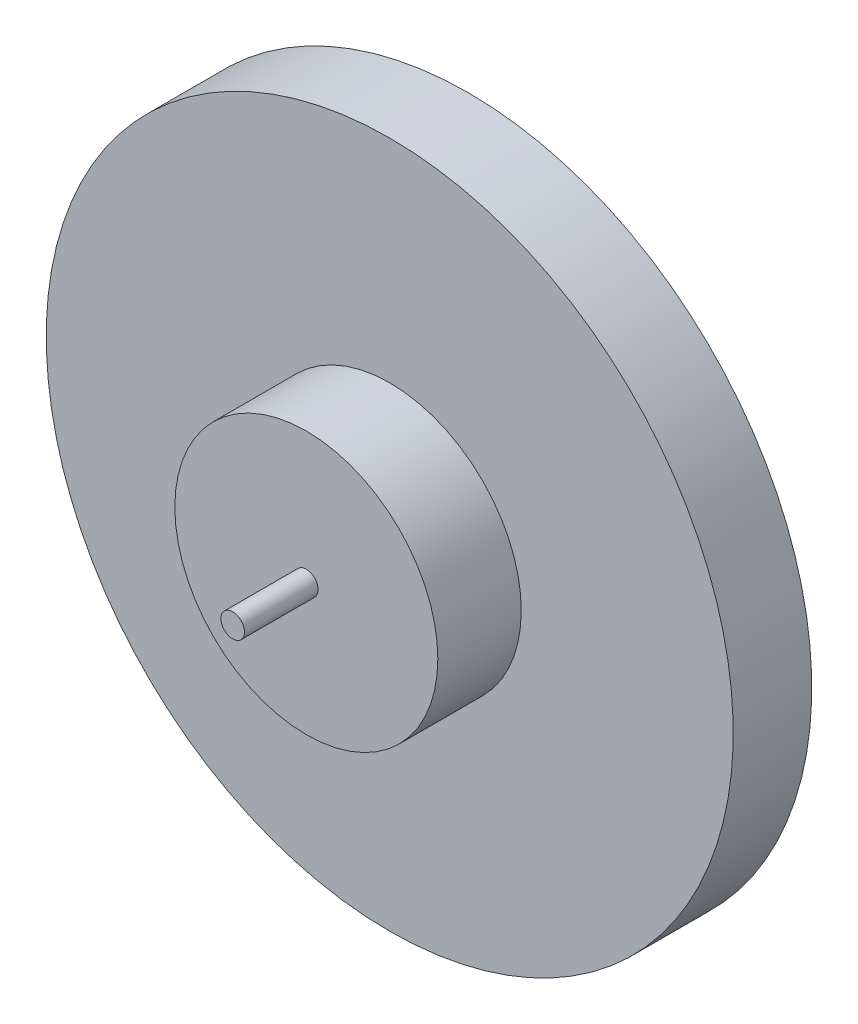
ISO-10303-21;
HEADER;
FILE_DESCRIPTION(('STEP AP214'),'2;1');
FILE_NAME('part.step','',(''),(''),'','','');
FILE_SCHEMA(('AUTOMOTIVE_DESIGN { 1 0 10303 214 1 1 1 1 }'));
ENDSEC;
DATA;
#1=APPLICATION_CONTEXT('core data for automotive mechanical design processes');
#2=APPLICATION_PROTOCOL_DEFINITION('international standard','automotive_design',2000,#1);
#3=PRODUCT_CONTEXT('',#1,'mechanical');
#4=PRODUCT('Part','Part','',(#3));
#5=PRODUCT_RELATED_PRODUCT_CATEGORY('part','',(#4));
#6=PRODUCT_DEFINITION_FORMATION('','',#4);
#7=PRODUCT_DEFINITION_CONTEXT('part definition',#1,'design');
#8=PRODUCT_DEFINITION('design','',#6,#7);
#9=PRODUCT_DEFINITION_SHAPE('','',#8);
#10=(LENGTH_UNIT() NAMED_UNIT(*) SI_UNIT(.MILLI.,.METRE.));
#11=(NAMED_UNIT(*) PLANE_ANGLE_UNIT() SI_UNIT($,.RADIAN.));
#12=(NAMED_UNIT(*) SI_UNIT($,.STERADIAN.) SOLID_ANGLE_UNIT());
#13=UNCERTAINTY_MEASURE_WITH_UNIT(LENGTH_MEASURE(1.E-05),#10,'distance_accuracy_value','');
#14=(GEOMETRIC_REPRESENTATION_CONTEXT(3) GLOBAL_UNCERTAINTY_ASSIGNED_CONTEXT((#13)) GLOBAL_UNIT_ASSIGNED_CONTEXT((#10,
#11,#12)) REPRESENTATION_CONTEXT('',''));
#15=CARTESIAN_POINT('',(0.,0.,0.));
#16=DIRECTION('',(0.,0.,1.));
#17=DIRECTION('',(1.,0.,0.));
#18=AXIS2_PLACEMENT_3D('',#15,#16,#17);
#19=CARTESIAN_POINT('',(0.,0.,-100.));
#20=DIRECTION('',(0.,0.,-1.));
#21=DIRECTION('',(0.,1.,0.));
#22=AXIS2_PLACEMENT_3D('',#19,#20,#21);
#23=CYLINDRICAL_SURFACE('',#22,175.);
#24=CARTESIAN_POINT('',(0.,0.,-19.9999999999999));
#25=DIRECTION('',(0.,0.,-1.));
#26=DIRECTION('',(0.,1.,0.));
#27=AXIS2_PLACEMENT_3D('',#24,#25,#26);
#28=CIRCLE('',#27,175.);
#29=CARTESIAN_POINT('',(0.,175.,-20.));
#30=VERTEX_POINT('',#29);
#31=EDGE_CURVE('E10',#30,#30,#28,.T.);
#32=ORIENTED_EDGE('',*,*,#31,.F.);
#33=EDGE_LOOP('',(#32));
#34=FACE_BOUND('',#33,.T.);
#35=CARTESIAN_POINT('',(0.,0.,19.9999999999999));
#36=DIRECTION('',(0.,0.,-1.));
#37=DIRECTION('',(0.,1.,0.));
#38=AXIS2_PLACEMENT_3D('',#35,#36,#37);
#39=CIRCLE('',#38,175.);
#40=CARTESIAN_POINT('',(0.,175.,20.));
#41=VERTEX_POINT('',#40);
#42=EDGE_CURVE('E64',#41,#41,#39,.T.);
#43=ORIENTED_EDGE('',*,*,#42,.T.);
#44=EDGE_LOOP('',(#43));
#45=FACE_BOUND('',#44,.T.);
#46=ADVANCED_FACE('F37',(#34,#45),#23,.T.);
#47=CARTESIAN_POINT('',(0.,175.,-20.));
#48=DIRECTION('',(0.,0.,-1.));
#49=DIRECTION('',(0.,1.,0.));
#50=AXIS2_PLACEMENT_3D('',#47,#48,#49);
#51=PLANE('',#50);
#52=ORIENTED_EDGE('',*,*,#31,.T.);
#53=EDGE_LOOP('',(#52));
#54=FACE_BOUND('',#53,.T.);
#55=CARTESIAN_POINT('',(0.,0.,-20.));
#56=DIRECTION('',(0.,0.,-1.));
#57=DIRECTION('',(0.,1.,0.));
#58=AXIS2_PLACEMENT_3D('',#55,#56,#57);
#59=CIRCLE('',#58,67.);
#60=CARTESIAN_POINT('',(0.,67.,-20.));
#61=VERTEX_POINT('',#60);
#62=EDGE_CURVE('E44',#61,#61,#59,.T.);
#63=ORIENTED_EDGE('',*,*,#62,.F.);
#64=EDGE_LOOP('',(#63));
#65=FACE_BOUND('',#64,.T.);
#66=ADVANCED_FACE('F97',(#54,#65),#51,.T.);
#67=CARTESIAN_POINT('',(0.,0.,-100.));
#68=DIRECTION('',(0.,0.,-1.));
#69=DIRECTION('',(0.,1.,0.));
#70=AXIS2_PLACEMENT_3D('',#67,#68,#69);
#71=CYLINDRICAL_SURFACE('',#70,67.);
#72=ORIENTED_EDGE('',*,*,#62,.T.);
#73=EDGE_LOOP('',(#72));
#74=FACE_BOUND('',#73,.T.);
#75=CARTESIAN_POINT('',(0.,0.,-62.4999999999999));
#76=DIRECTION('',(0.,0.,-1.));
#77=DIRECTION('',(0.,1.,0.));
#78=AXIS2_PLACEMENT_3D('',#75,#76,#77);
#79=CIRCLE('',#78,67.);
#80=CARTESIAN_POINT('',(0.,67.,-62.5));
#81=VERTEX_POINT('',#80);
#82=EDGE_CURVE('E49',#81,#81,#79,.T.);
#83=ORIENTED_EDGE('',*,*,#82,.F.);
#84=EDGE_LOOP('',(#83));
#85=FACE_BOUND('',#84,.T.);
#86=ADVANCED_FACE('F102',(#74,#85),#71,.T.);
#87=CARTESIAN_POINT('',(0.,67.,-62.5));
#88=DIRECTION('',(0.,0.,-1.));
#89=DIRECTION('',(0.,1.,0.));
#90=AXIS2_PLACEMENT_3D('',#87,#88,#89);
#91=PLANE('',#90);
#92=ORIENTED_EDGE('',*,*,#82,.T.);
#93=EDGE_LOOP('',(#92));
#94=FACE_BOUND('',#93,.T.);
#95=CARTESIAN_POINT('',(0.,0.,-62.5));
#96=DIRECTION('',(0.,0.,-1.));
#97=DIRECTION('',(0.,1.,0.));
#98=AXIS2_PLACEMENT_3D('',#95,#96,#97);
#99=CIRCLE('',#98,6.00000000000004);
#100=CARTESIAN_POINT('',(0.,6.,-62.5));
#101=VERTEX_POINT('',#100);
#102=EDGE_CURVE('E54',#101,#101,#99,.T.);
#103=ORIENTED_EDGE('',*,*,#102,.F.);
#104=EDGE_LOOP('',(#103));
#105=FACE_BOUND('',#104,.T.);
#106=ADVANCED_FACE('F132',(#94,#105),#91,.T.);
#107=CARTESIAN_POINT('',(0.,0.,-100.));
#108=DIRECTION('',(0.,0.,-1.));
#109=DIRECTION('',(0.,1.,0.));
#110=AXIS2_PLACEMENT_3D('',#107,#108,#109);
#111=CYLINDRICAL_SURFACE('',#110,6.00000000000005);
#112=ORIENTED_EDGE('',*,*,#102,.T.);
#113=EDGE_LOOP('',(#112));
#114=FACE_BOUND('',#113,.T.);
#115=CARTESIAN_POINT('',(0.,0.,-100.));
#116=DIRECTION('',(0.,0.,-1.));
#117=DIRECTION('',(0.,1.,0.));
#118=AXIS2_PLACEMENT_3D('',#115,#116,#117);
#119=CIRCLE('',#118,6.00000000000007);
#120=CARTESIAN_POINT('',(0.,6.,-100.));
#121=VERTEX_POINT('',#120);
#122=EDGE_CURVE('E60',#121,#121,#119,.T.);
#123=ORIENTED_EDGE('',*,*,#122,.F.);
#124=EDGE_LOOP('',(#123));
#125=FACE_BOUND('',#124,.T.);
#126=ADVANCED_FACE('F128',(#114,#125),#111,.T.);
#127=CARTESIAN_POINT('',(0.,6.,-100.));
#128=DIRECTION('',(0.,0.,-1.));
#129=DIRECTION('',(0.,1.,0.));
#130=AXIS2_PLACEMENT_3D('',#127,#128,#129);
#131=PLANE('',#130);
#132=ORIENTED_EDGE('',*,*,#122,.T.);
#133=EDGE_LOOP('',(#132));
#134=FACE_BOUND('',#133,.T.);
#135=ADVANCED_FACE('F110',(#134),#131,.T.);
#136=CARTESIAN_POINT('',(0.,175.,20.));
#137=DIRECTION('',(0.,0.,1.));
#138=DIRECTION('',(0.,1.,0.));
#139=AXIS2_PLACEMENT_3D('',#136,#137,#138);
#140=PLANE('',#139);
#141=ORIENTED_EDGE('',*,*,#42,.F.);
#142=EDGE_LOOP('',(#141));
#143=FACE_BOUND('',#142,.T.);
#144=CARTESIAN_POINT('',(0.,0.,20.));
#145=DIRECTION('',(0.,0.,-1.));
#146=DIRECTION('',(0.,1.,0.));
#147=AXIS2_PLACEMENT_3D('',#144,#145,#146);
#148=CIRCLE('',#147,67.);
#149=CARTESIAN_POINT('',(0.,67.,20.));
#150=VERTEX_POINT('',#149);
#151=EDGE_CURVE('E68',#150,#150,#148,.T.);
#152=ORIENTED_EDGE('',*,*,#151,.T.);
#153=EDGE_LOOP('',(#152));
#154=FACE_BOUND('',#153,.T.);
#155=ADVANCED_FACE('F106',(#143,#154),#140,.T.);
#156=CARTESIAN_POINT('',(0.,0.,100.));
#157=DIRECTION('',(0.,0.,1.));
#158=DIRECTION('',(0.,1.,0.));
#159=AXIS2_PLACEMENT_3D('',#156,#157,#158);
#160=CYLINDRICAL_SURFACE('',#159,67.);
#161=ORIENTED_EDGE('',*,*,#151,.F.);
#162=EDGE_LOOP('',(#161));
#163=FACE_BOUND('',#162,.T.);
#164=CARTESIAN_POINT('',(0.,0.,62.4999999999999));
#165=DIRECTION('',(0.,0.,-1.));
#166=DIRECTION('',(0.,1.,0.));
#167=AXIS2_PLACEMENT_3D('',#164,#165,#166);
#168=CIRCLE('',#167,67.);
#169=CARTESIAN_POINT('',(0.,67.,62.5));
#170=VERTEX_POINT('',#169);
#171=EDGE_CURVE('E72',#170,#170,#168,.T.);
#172=ORIENTED_EDGE('',*,*,#171,.T.);
#173=EDGE_LOOP('',(#172));
#174=FACE_BOUND('',#173,.T.);
#175=ADVANCED_FACE('F109',(#163,#174),#160,.T.);
#176=CARTESIAN_POINT('',(0.,67.,62.5));
#177=DIRECTION('',(0.,0.,1.));
#178=DIRECTION('',(0.,1.,0.));
#179=AXIS2_PLACEMENT_3D('',#176,#177,#178);
#180=PLANE('',#179);
#181=ORIENTED_EDGE('',*,*,#171,.F.);
#182=EDGE_LOOP('',(#181));
#183=FACE_BOUND('',#182,.T.);
#184=CARTESIAN_POINT('',(0.,0.,62.5));
#185=DIRECTION('',(0.,0.,-1.));
#186=DIRECTION('',(0.,1.,0.));
#187=AXIS2_PLACEMENT_3D('',#184,#185,#186);
#188=CIRCLE('',#187,6.00000000000004);
#189=CARTESIAN_POINT('',(0.,6.,62.5));
#190=VERTEX_POINT('',#189);
#191=EDGE_CURVE('E76',#190,#190,#188,.T.);
#192=ORIENTED_EDGE('',*,*,#191,.T.);
#193=EDGE_LOOP('',(#192));
#194=FACE_BOUND('',#193,.T.);
#195=ADVANCED_FACE('F93',(#183,#194),#180,.T.);
#196=CARTESIAN_POINT('',(0.,0.,100.));
#197=DIRECTION('',(0.,0.,1.));
#198=DIRECTION('',(0.,1.,0.));
#199=AXIS2_PLACEMENT_3D('',#196,#197,#198);
#200=CYLINDRICAL_SURFACE('',#199,6.00000000000005);
#201=ORIENTED_EDGE('',*,*,#191,.F.);
#202=EDGE_LOOP('',(#201));
#203=FACE_BOUND('',#202,.T.);
#204=CARTESIAN_POINT('',(0.,0.,100.));
#205=DIRECTION('',(0.,0.,-1.));
#206=DIRECTION('',(0.,1.,0.));
#207=AXIS2_PLACEMENT_3D('',#204,#205,#206);
#208=CIRCLE('',#207,6.00000000000007);
#209=CARTESIAN_POINT('',(0.,6.,100.));
#210=VERTEX_POINT('',#209);
#211=EDGE_CURVE('E80',#210,#210,#208,.T.);
#212=ORIENTED_EDGE('',*,*,#211,.T.);
#213=EDGE_LOOP('',(#212));
#214=FACE_BOUND('',#213,.T.);
#215=ADVANCED_FACE('F85',(#203,#214),#200,.T.);
#216=CARTESIAN_POINT('',(0.,6.,100.));
#217=DIRECTION('',(0.,0.,1.));
#218=DIRECTION('',(0.,1.,0.));
#219=AXIS2_PLACEMENT_3D('',#216,#217,#218);
#220=PLANE('',#219);
#221=ORIENTED_EDGE('',*,*,#211,.F.);
#222=EDGE_LOOP('',(#221));
#223=FACE_BOUND('',#222,.T.);
#224=ADVANCED_FACE('F87',(#223),#220,.T.);
#225=CLOSED_SHELL('',(#46,#66,#86,#106,#126,#135,#155,#175,#195,#215,#224));
#226=MANIFOLD_SOLID_BREP('B2',#225);
#227=ADVANCED_BREP_SHAPE_REPRESENTATION('',(#18,#226),#14);
#228=SHAPE_DEFINITION_REPRESENTATION(#9,#227);
ENDSEC;
END-ISO-10303-21;
